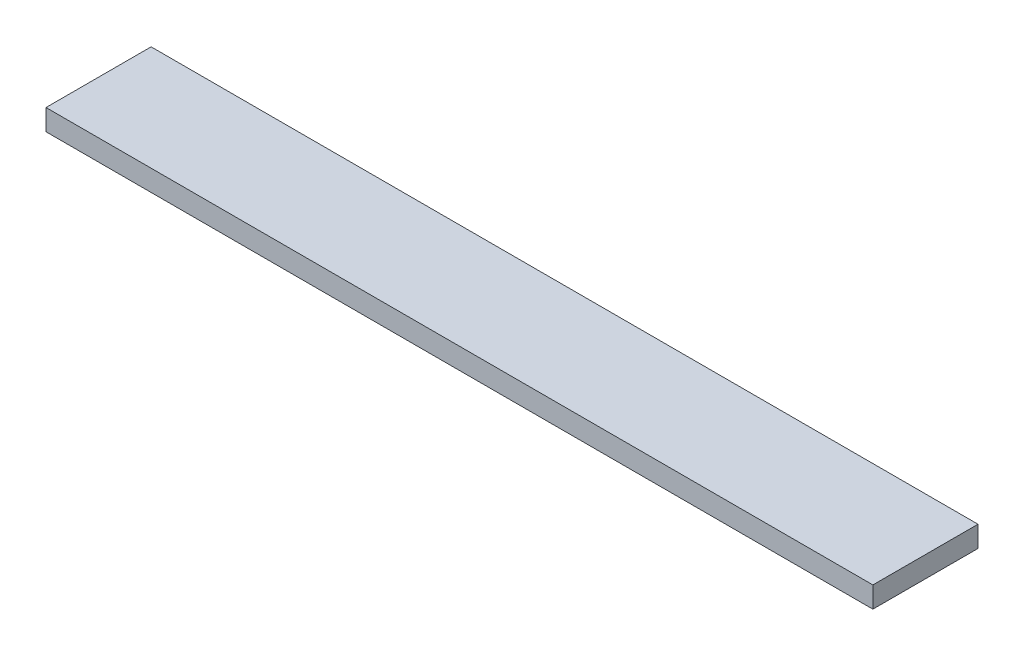
ISO-10303-21;
HEADER;
FILE_DESCRIPTION(('STEP AP214'),'2;1');
FILE_NAME('part.step','',(''),(''),'','','');
FILE_SCHEMA(('AUTOMOTIVE_DESIGN { 1 0 10303 214 1 1 1 1 }'));
ENDSEC;
DATA;
#1=APPLICATION_CONTEXT('core data for automotive mechanical design processes');
#2=APPLICATION_PROTOCOL_DEFINITION('international standard','automotive_design',2000,#1);
#3=PRODUCT_CONTEXT('',#1,'mechanical');
#4=PRODUCT('Part','Part','',(#3));
#5=PRODUCT_RELATED_PRODUCT_CATEGORY('part','',(#4));
#6=PRODUCT_DEFINITION_FORMATION('','',#4);
#7=PRODUCT_DEFINITION_CONTEXT('part definition',#1,'design');
#8=PRODUCT_DEFINITION('design','',#6,#7);
#9=PRODUCT_DEFINITION_SHAPE('','',#8);
#10=(LENGTH_UNIT() NAMED_UNIT(*) SI_UNIT(.MILLI.,.METRE.));
#11=(NAMED_UNIT(*) PLANE_ANGLE_UNIT() SI_UNIT($,.RADIAN.));
#12=(NAMED_UNIT(*) SI_UNIT($,.STERADIAN.) SOLID_ANGLE_UNIT());
#13=UNCERTAINTY_MEASURE_WITH_UNIT(LENGTH_MEASURE(1.E-05),#10,'distance_accuracy_value','');
#14=(GEOMETRIC_REPRESENTATION_CONTEXT(3) GLOBAL_UNCERTAINTY_ASSIGNED_CONTEXT((#13)) GLOBAL_UNIT_ASSIGNED_CONTEXT((#10,
#11,#12)) REPRESENTATION_CONTEXT('',''));
#15=CARTESIAN_POINT('',(0.,0.,0.));
#16=DIRECTION('',(0.,0.,1.));
#17=DIRECTION('',(1.,0.,0.));
#18=AXIS2_PLACEMENT_3D('',#15,#16,#17);
#19=CARTESIAN_POINT('',(1180.,0.,150.));
#20=DIRECTION('',(0.,1.,0.));
#21=DIRECTION('',(-1.,0.,0.));
#22=AXIS2_PLACEMENT_3D('',#19,#20,#21);
#23=PLANE('',#22);
#24=DIRECTION('',(1.,0.,0.));
#25=VECTOR('',#24,1.);
#26=CARTESIAN_POINT('',(1180.,0.,0.));
#27=LINE('',#26,#25);
#28=CARTESIAN_POINT('',(0.,0.,0.));
#29=VERTEX_POINT('',#28);
#30=CARTESIAN_POINT('',(1180.,0.,0.));
#31=VERTEX_POINT('',#30);
#32=EDGE_CURVE('E96',#29,#31,#27,.T.);
#33=ORIENTED_EDGE('',*,*,#32,.T.);
#34=DIRECTION('',(0.,0.,-1.));
#35=VECTOR('',#34,1.);
#36=CARTESIAN_POINT('',(1180.,0.,150.));
#37=LINE('',#36,#35);
#38=CARTESIAN_POINT('',(1180.,0.,150.));
#39=VERTEX_POINT('',#38);
#40=EDGE_CURVE('E11',#39,#31,#37,.T.);
#41=ORIENTED_EDGE('',*,*,#40,.F.);
#42=DIRECTION('',(1.,0.,0.));
#43=VECTOR('',#42,1.);
#44=CARTESIAN_POINT('',(1180.,0.,150.));
#45=LINE('',#44,#43);
#46=CARTESIAN_POINT('',(0.,0.,150.));
#47=VERTEX_POINT('',#46);
#48=EDGE_CURVE('E84',#47,#39,#45,.T.);
#49=ORIENTED_EDGE('',*,*,#48,.F.);
#50=DIRECTION('',(0.,0.,-1.));
#51=VECTOR('',#50,1.);
#52=CARTESIAN_POINT('',(0.,0.,150.));
#53=LINE('',#52,#51);
#54=EDGE_CURVE('E92',#47,#29,#53,.T.);
#55=ORIENTED_EDGE('',*,*,#54,.T.);
#56=EDGE_LOOP('',(#33,#41,#49,#55));
#57=FACE_BOUND('',#56,.T.);
#58=ADVANCED_FACE('F33',(#57),#23,.F.);
#59=CARTESIAN_POINT('',(1180.,30.,150.));
#60=DIRECTION('',(-1.,0.,0.));
#61=DIRECTION('',(0.,0.,1.));
#62=AXIS2_PLACEMENT_3D('',#59,#60,#61);
#63=PLANE('',#62);
#64=DIRECTION('',(0.,1.,0.));
#65=VECTOR('',#64,1.);
#66=CARTESIAN_POINT('',(1180.,30.,0.));
#67=LINE('',#66,#65);
#68=CARTESIAN_POINT('',(1180.,30.,0.));
#69=VERTEX_POINT('',#68);
#70=EDGE_CURVE('E88',#31,#69,#67,.T.);
#71=ORIENTED_EDGE('',*,*,#70,.T.);
#72=DIRECTION('',(0.,0.,-1.));
#73=VECTOR('',#72,1.);
#74=CARTESIAN_POINT('',(1180.,30.,150.));
#75=LINE('',#74,#73);
#76=CARTESIAN_POINT('',(1180.,30.,150.));
#77=VERTEX_POINT('',#76);
#78=EDGE_CURVE('E41',#77,#69,#75,.T.);
#79=ORIENTED_EDGE('',*,*,#78,.F.);
#80=DIRECTION('',(0.,1.,0.));
#81=VECTOR('',#80,1.);
#82=CARTESIAN_POINT('',(1180.,30.,150.));
#83=LINE('',#82,#81);
#84=EDGE_CURVE('E79',#39,#77,#83,.T.);
#85=ORIENTED_EDGE('',*,*,#84,.F.);
#86=ORIENTED_EDGE('',*,*,#40,.T.);
#87=EDGE_LOOP('',(#71,#79,#85,#86));
#88=FACE_BOUND('',#87,.T.);
#89=ADVANCED_FACE('F87',(#88),#63,.F.);
#90=CARTESIAN_POINT('',(0.,30.,150.));
#91=DIRECTION('',(0.,-1.,0.));
#92=DIRECTION('',(1.,0.,0.));
#93=AXIS2_PLACEMENT_3D('',#90,#91,#92);
#94=PLANE('',#93);
#95=DIRECTION('',(-1.,0.,0.));
#96=VECTOR('',#95,1.);
#97=CARTESIAN_POINT('',(0.,30.,0.));
#98=LINE('',#97,#96);
#99=CARTESIAN_POINT('',(0.,30.,0.));
#100=VERTEX_POINT('',#99);
#101=EDGE_CURVE('E66',#69,#100,#98,.T.);
#102=ORIENTED_EDGE('',*,*,#101,.T.);
#103=DIRECTION('',(0.,0.,-1.));
#104=VECTOR('',#103,1.);
#105=CARTESIAN_POINT('',(0.,30.,150.));
#106=LINE('',#105,#104);
#107=CARTESIAN_POINT('',(0.,30.,150.));
#108=VERTEX_POINT('',#107);
#109=EDGE_CURVE('E89',#108,#100,#106,.T.);
#110=ORIENTED_EDGE('',*,*,#109,.F.);
#111=DIRECTION('',(-1.,0.,0.));
#112=VECTOR('',#111,1.);
#113=CARTESIAN_POINT('',(0.,30.,150.));
#114=LINE('',#113,#112);
#115=EDGE_CURVE('E82',#77,#108,#114,.T.);
#116=ORIENTED_EDGE('',*,*,#115,.F.);
#117=ORIENTED_EDGE('',*,*,#78,.T.);
#118=EDGE_LOOP('',(#102,#110,#116,#117));
#119=FACE_BOUND('',#118,.T.);
#120=ADVANCED_FACE('F90',(#119),#94,.F.);
#121=CARTESIAN_POINT('',(0.,0.,150.));
#122=DIRECTION('',(1.,0.,0.));
#123=DIRECTION('',(0.,0.,-1.));
#124=AXIS2_PLACEMENT_3D('',#121,#122,#123);
#125=PLANE('',#124);
#126=DIRECTION('',(0.,-1.,0.));
#127=VECTOR('',#126,1.);
#128=CARTESIAN_POINT('',(0.,0.,0.));
#129=LINE('',#128,#127);
#130=EDGE_CURVE('E72',#100,#29,#129,.T.);
#131=ORIENTED_EDGE('',*,*,#130,.T.);
#132=ORIENTED_EDGE('',*,*,#54,.F.);
#133=DIRECTION('',(0.,-1.,0.));
#134=VECTOR('',#133,1.);
#135=CARTESIAN_POINT('',(0.,0.,150.));
#136=LINE('',#135,#134);
#137=EDGE_CURVE('E49',#108,#47,#136,.T.);
#138=ORIENTED_EDGE('',*,*,#137,.F.);
#139=ORIENTED_EDGE('',*,*,#109,.T.);
#140=EDGE_LOOP('',(#131,#132,#138,#139));
#141=FACE_BOUND('',#140,.T.);
#142=ADVANCED_FACE('F103',(#141),#125,.F.);
#143=CARTESIAN_POINT('',(0.,0.,150.));
#144=DIRECTION('',(0.,0.,-1.));
#145=DIRECTION('',(-1.,0.,0.));
#146=AXIS2_PLACEMENT_3D('',#143,#144,#145);
#147=PLANE('',#146);
#148=ORIENTED_EDGE('',*,*,#48,.T.);
#149=ORIENTED_EDGE('',*,*,#84,.T.);
#150=ORIENTED_EDGE('',*,*,#115,.T.);
#151=ORIENTED_EDGE('',*,*,#137,.T.);
#152=EDGE_LOOP('',(#148,#149,#150,#151));
#153=FACE_BOUND('',#152,.T.);
#154=ADVANCED_FACE('F80',(#153),#147,.F.);
#155=CARTESIAN_POINT('',(0.,0.,0.));
#156=DIRECTION('',(0.,0.,-1.));
#157=DIRECTION('',(-1.,0.,0.));
#158=AXIS2_PLACEMENT_3D('',#155,#156,#157);
#159=PLANE('',#158);
#160=ORIENTED_EDGE('',*,*,#32,.F.);
#161=ORIENTED_EDGE('',*,*,#130,.F.);
#162=ORIENTED_EDGE('',*,*,#101,.F.);
#163=ORIENTED_EDGE('',*,*,#70,.F.);
#164=EDGE_LOOP('',(#160,#161,#162,#163));
#165=FACE_BOUND('',#164,.T.);
#166=ADVANCED_FACE('F106',(#165),#159,.T.);
#167=CLOSED_SHELL('',(#58,#89,#120,#142,#154,#166));
#168=MANIFOLD_SOLID_BREP('B2',#167);
#169=ADVANCED_BREP_SHAPE_REPRESENTATION('',(#18,#168),#14);
#170=SHAPE_DEFINITION_REPRESENTATION(#9,#169);
ENDSEC;
END-ISO-10303-21;
